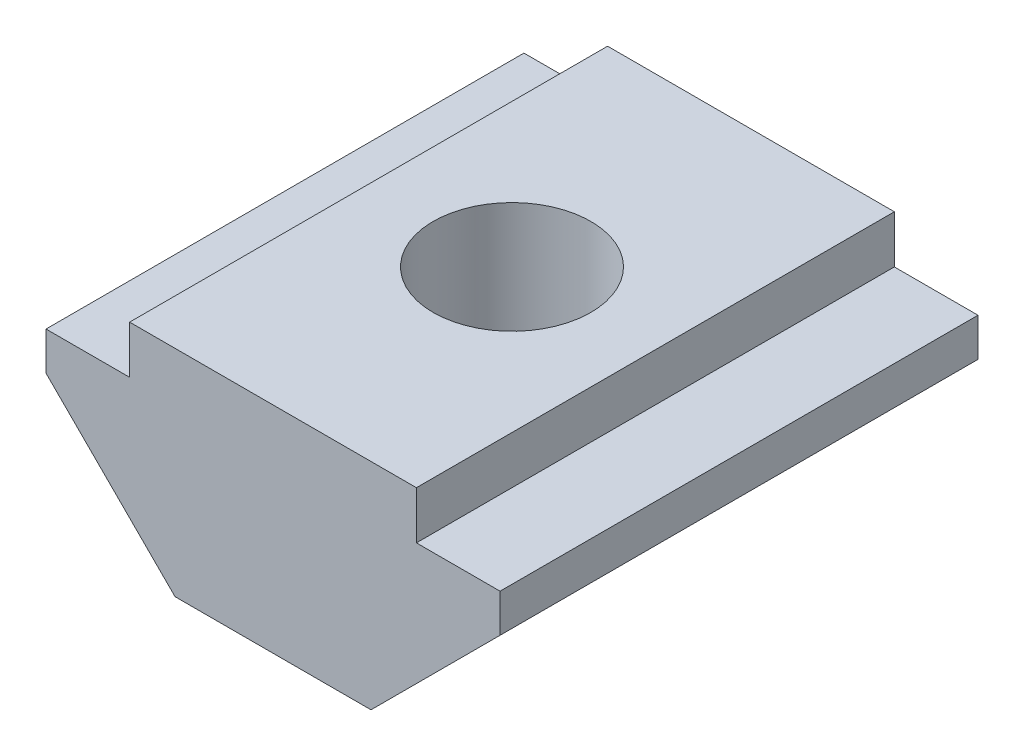
ISO-10303-21;
HEADER;
FILE_DESCRIPTION(('STEP AP214'),'2;1');
FILE_NAME('part.step','',(''),(''),'','','');
FILE_SCHEMA(('AUTOMOTIVE_DESIGN { 1 0 10303 214 1 1 1 1 }'));
ENDSEC;
DATA;
#1=APPLICATION_CONTEXT('core data for automotive mechanical design processes');
#2=APPLICATION_PROTOCOL_DEFINITION('international standard','automotive_design',2000,#1);
#3=PRODUCT_CONTEXT('',#1,'mechanical');
#4=PRODUCT('Part','Part','',(#3));
#5=PRODUCT_RELATED_PRODUCT_CATEGORY('part','',(#4));
#6=PRODUCT_DEFINITION_FORMATION('','',#4);
#7=PRODUCT_DEFINITION_CONTEXT('part definition',#1,'design');
#8=PRODUCT_DEFINITION('design','',#6,#7);
#9=PRODUCT_DEFINITION_SHAPE('','',#8);
#10=(LENGTH_UNIT() NAMED_UNIT(*) SI_UNIT(.MILLI.,.METRE.));
#11=(NAMED_UNIT(*) PLANE_ANGLE_UNIT() SI_UNIT($,.RADIAN.));
#12=(NAMED_UNIT(*) SI_UNIT($,.STERADIAN.) SOLID_ANGLE_UNIT());
#13=UNCERTAINTY_MEASURE_WITH_UNIT(LENGTH_MEASURE(1.E-05),#10,'distance_accuracy_value','');
#14=(GEOMETRIC_REPRESENTATION_CONTEXT(3) GLOBAL_UNCERTAINTY_ASSIGNED_CONTEXT((#13)) GLOBAL_UNIT_ASSIGNED_CONTEXT((#10,
#11,#12)) REPRESENTATION_CONTEXT('',''));
#15=CARTESIAN_POINT('',(0.,0.,0.));
#16=DIRECTION('',(0.,0.,1.));
#17=DIRECTION('',(1.,0.,0.));
#18=AXIS2_PLACEMENT_3D('',#15,#16,#17);
#19=CARTESIAN_POINT('',(-4.75,0.,5.));
#20=DIRECTION('',(-1.,0.,0.));
#21=DIRECTION('',(0.,0.,1.));
#22=AXIS2_PLACEMENT_3D('',#19,#20,#21);
#23=PLANE('',#22);
#24=DIRECTION('',(0.,1.,0.));
#25=VECTOR('',#24,1.);
#26=CARTESIAN_POINT('',(-4.75,0.,-5.));
#27=LINE('',#26,#25);
#28=CARTESIAN_POINT('',(-4.75,1.88602941176471,-5.));
#29=VERTEX_POINT('',#28);
#30=CARTESIAN_POINT('',(-4.75,2.68602941176471,-5.));
#31=VERTEX_POINT('',#30);
#32=EDGE_CURVE('E147',#29,#31,#27,.T.);
#33=ORIENTED_EDGE('',*,*,#32,.F.);
#34=DIRECTION('',(0.,0.,-1.));
#35=VECTOR('',#34,1.);
#36=CARTESIAN_POINT('',(-4.75,1.88602941176471,5.));
#37=LINE('',#36,#35);
#38=CARTESIAN_POINT('',(-4.75,1.88602941176471,5.));
#39=VERTEX_POINT('',#38);
#40=EDGE_CURVE('E11',#39,#29,#37,.T.);
#41=ORIENTED_EDGE('',*,*,#40,.F.);
#42=DIRECTION('',(0.,1.,0.));
#43=VECTOR('',#42,1.);
#44=CARTESIAN_POINT('',(-4.75,0.,5.));
#45=LINE('',#44,#43);
#46=CARTESIAN_POINT('',(-4.75,2.68602941176471,5.));
#47=VERTEX_POINT('',#46);
#48=EDGE_CURVE('E214',#39,#47,#45,.T.);
#49=ORIENTED_EDGE('',*,*,#48,.T.);
#50=DIRECTION('',(0.,0.,-1.));
#51=VECTOR('',#50,1.);
#52=CARTESIAN_POINT('',(-4.75,2.68602941176471,5.));
#53=LINE('',#52,#51);
#54=EDGE_CURVE('E57',#47,#31,#53,.T.);
#55=ORIENTED_EDGE('',*,*,#54,.T.);
#56=EDGE_LOOP('',(#33,#41,#49,#55));
#57=FACE_BOUND('',#56,.T.);
#58=ADVANCED_FACE('F41',(#57),#23,.T.);
#59=CARTESIAN_POINT('',(-1.43198529411764,-1.43198529411764,5.));
#60=DIRECTION('',(-0.707106781186547,-0.707106781186548,0.));
#61=DIRECTION('',(0.707106781186548,-0.707106781186547,0.));
#62=AXIS2_PLACEMENT_3D('',#59,#60,#61);
#63=PLANE('',#62);
#64=DIRECTION('',(-0.707106781186548,0.707106781186547,0.));
#65=VECTOR('',#64,1.);
#66=CARTESIAN_POINT('',(-1.43198529411764,-1.43198529411764,-5.));
#67=LINE('',#66,#65);
#68=CARTESIAN_POINT('',(-2.04999999999999,-0.813970588235293,-5.));
#69=VERTEX_POINT('',#68);
#70=EDGE_CURVE('E149',#69,#29,#67,.T.);
#71=ORIENTED_EDGE('',*,*,#70,.F.);
#72=DIRECTION('',(0.,0.,-1.));
#73=VECTOR('',#72,1.);
#74=CARTESIAN_POINT('',(-2.04999999999999,-0.813970588235293,5.));
#75=LINE('',#74,#73);
#76=CARTESIAN_POINT('',(-2.04999999999999,-0.813970588235293,5.));
#77=VERTEX_POINT('',#76);
#78=EDGE_CURVE('E49',#77,#69,#75,.T.);
#79=ORIENTED_EDGE('',*,*,#78,.F.);
#80=DIRECTION('',(-0.707106781186548,0.707106781186547,0.));
#81=VECTOR('',#80,1.);
#82=CARTESIAN_POINT('',(-1.43198529411764,-1.43198529411764,5.));
#83=LINE('',#82,#81);
#84=EDGE_CURVE('E212',#77,#39,#83,.T.);
#85=ORIENTED_EDGE('',*,*,#84,.T.);
#86=ORIENTED_EDGE('',*,*,#40,.T.);
#87=EDGE_LOOP('',(#71,#79,#85,#86));
#88=FACE_BOUND('',#87,.T.);
#89=ADVANCED_FACE('F192',(#88),#63,.T.);
#90=CARTESIAN_POINT('',(0.,-0.813970588235292,5.));
#91=DIRECTION('',(0.,-1.,0.));
#92=DIRECTION('',(1.,0.,0.));
#93=AXIS2_PLACEMENT_3D('',#90,#91,#92);
#94=PLANE('',#93);
#95=CARTESIAN_POINT('',(0.,-0.813970588235292,0.));
#96=DIRECTION('',(0.,1.,0.));
#97=DIRECTION('',(0.,0.,1.));
#98=AXIS2_PLACEMENT_3D('',#95,#96,#97);
#99=CIRCLE('',#98,1.65);
#100=CARTESIAN_POINT('',(0.,-0.813970588235292,1.65));
#101=VERTEX_POINT('',#100);
#102=EDGE_CURVE('E150',#101,#101,#99,.T.);
#103=ORIENTED_EDGE('',*,*,#102,.T.);
#104=EDGE_LOOP('',(#103));
#105=FACE_BOUND('',#104,.T.);
#106=DIRECTION('',(-1.,0.,0.));
#107=VECTOR('',#106,1.);
#108=CARTESIAN_POINT('',(0.,-0.813970588235292,-5.));
#109=LINE('',#108,#107);
#110=CARTESIAN_POINT('',(2.04999999999999,-0.813970588235292,-5.));
#111=VERTEX_POINT('',#110);
#112=EDGE_CURVE('E153',#111,#69,#109,.T.);
#113=ORIENTED_EDGE('',*,*,#112,.F.);
#114=DIRECTION('',(0.,0.,-1.));
#115=VECTOR('',#114,1.);
#116=CARTESIAN_POINT('',(2.04999999999999,-0.813970588235292,5.));
#117=LINE('',#116,#115);
#118=CARTESIAN_POINT('',(2.04999999999999,-0.813970588235292,5.));
#119=VERTEX_POINT('',#118);
#120=EDGE_CURVE('E181',#119,#111,#117,.T.);
#121=ORIENTED_EDGE('',*,*,#120,.F.);
#122=DIRECTION('',(-1.,0.,0.));
#123=VECTOR('',#122,1.);
#124=CARTESIAN_POINT('',(0.,-0.813970588235292,5.));
#125=LINE('',#124,#123);
#126=EDGE_CURVE('E188',#119,#77,#125,.T.);
#127=ORIENTED_EDGE('',*,*,#126,.T.);
#128=ORIENTED_EDGE('',*,*,#78,.T.);
#129=EDGE_LOOP('',(#113,#121,#127,#128));
#130=FACE_BOUND('',#129,.T.);
#131=ADVANCED_FACE('F186',(#105,#130),#94,.T.);
#132=CARTESIAN_POINT('',(1.43198529411764,-1.43198529411764,5.));
#133=DIRECTION('',(-0.707106781186547,0.707106781186548,0.));
#134=DIRECTION('',(-0.707106781186548,-0.707106781186547,0.));
#135=AXIS2_PLACEMENT_3D('',#132,#133,#134);
#136=PLANE('',#135);
#137=DIRECTION('',(0.707106781186548,0.707106781186547,0.));
#138=VECTOR('',#137,1.);
#139=CARTESIAN_POINT('',(1.43198529411764,-1.43198529411764,-5.));
#140=LINE('',#139,#138);
#141=CARTESIAN_POINT('',(4.75,1.88602941176471,-5.));
#142=VERTEX_POINT('',#141);
#143=EDGE_CURVE('E156',#111,#142,#140,.T.);
#144=ORIENTED_EDGE('',*,*,#143,.T.);
#145=DIRECTION('',(0.,0.,-1.));
#146=VECTOR('',#145,1.);
#147=CARTESIAN_POINT('',(4.75,1.88602941176471,5.));
#148=LINE('',#147,#146);
#149=CARTESIAN_POINT('',(4.75,1.88602941176471,5.));
#150=VERTEX_POINT('',#149);
#151=EDGE_CURVE('E178',#150,#142,#148,.T.);
#152=ORIENTED_EDGE('',*,*,#151,.F.);
#153=DIRECTION('',(0.707106781186548,0.707106781186547,0.));
#154=VECTOR('',#153,1.);
#155=CARTESIAN_POINT('',(1.43198529411764,-1.43198529411764,5.));
#156=LINE('',#155,#154);
#157=EDGE_CURVE('E207',#119,#150,#156,.T.);
#158=ORIENTED_EDGE('',*,*,#157,.F.);
#159=ORIENTED_EDGE('',*,*,#120,.T.);
#160=EDGE_LOOP('',(#144,#152,#158,#159));
#161=FACE_BOUND('',#160,.T.);
#162=ADVANCED_FACE('F199',(#161),#136,.F.);
#163=CARTESIAN_POINT('',(4.75,0.,5.));
#164=DIRECTION('',(-1.,0.,0.));
#165=DIRECTION('',(0.,0.,1.));
#166=AXIS2_PLACEMENT_3D('',#163,#164,#165);
#167=PLANE('',#166);
#168=DIRECTION('',(0.,1.,0.));
#169=VECTOR('',#168,1.);
#170=CARTESIAN_POINT('',(4.75,0.,-5.));
#171=LINE('',#170,#169);
#172=CARTESIAN_POINT('',(4.75,2.68602941176471,-5.));
#173=VERTEX_POINT('',#172);
#174=EDGE_CURVE('E158',#142,#173,#171,.T.);
#175=ORIENTED_EDGE('',*,*,#174,.T.);
#176=DIRECTION('',(0.,0.,-1.));
#177=VECTOR('',#176,1.);
#178=CARTESIAN_POINT('',(4.75,2.68602941176471,5.));
#179=LINE('',#178,#177);
#180=CARTESIAN_POINT('',(4.75,2.68602941176471,5.));
#181=VERTEX_POINT('',#180);
#182=EDGE_CURVE('E176',#181,#173,#179,.T.);
#183=ORIENTED_EDGE('',*,*,#182,.F.);
#184=DIRECTION('',(0.,1.,0.));
#185=VECTOR('',#184,1.);
#186=CARTESIAN_POINT('',(4.75,0.,5.));
#187=LINE('',#186,#185);
#188=EDGE_CURVE('E205',#150,#181,#187,.T.);
#189=ORIENTED_EDGE('',*,*,#188,.F.);
#190=ORIENTED_EDGE('',*,*,#151,.T.);
#191=EDGE_LOOP('',(#175,#183,#189,#190));
#192=FACE_BOUND('',#191,.T.);
#193=ADVANCED_FACE('F203',(#192),#167,.F.);
#194=CARTESIAN_POINT('',(0.,2.68602941176471,5.));
#195=DIRECTION('',(0.,1.,0.));
#196=DIRECTION('',(-1.,0.,0.));
#197=AXIS2_PLACEMENT_3D('',#194,#195,#196);
#198=PLANE('',#197);
#199=DIRECTION('',(1.,0.,0.));
#200=VECTOR('',#199,1.);
#201=CARTESIAN_POINT('',(0.,2.68602941176471,-5.));
#202=LINE('',#201,#200);
#203=CARTESIAN_POINT('',(3.,2.68602941176471,-5.));
#204=VERTEX_POINT('',#203);
#205=EDGE_CURVE('E161',#204,#173,#202,.T.);
#206=ORIENTED_EDGE('',*,*,#205,.F.);
#207=DIRECTION('',(0.,0.,-1.));
#208=VECTOR('',#207,1.);
#209=CARTESIAN_POINT('',(3.,2.68602941176471,5.));
#210=LINE('',#209,#208);
#211=CARTESIAN_POINT('',(3.,2.68602941176471,5.));
#212=VERTEX_POINT('',#211);
#213=EDGE_CURVE('E174',#212,#204,#210,.T.);
#214=ORIENTED_EDGE('',*,*,#213,.F.);
#215=DIRECTION('',(1.,0.,0.));
#216=VECTOR('',#215,1.);
#217=CARTESIAN_POINT('',(0.,2.68602941176471,5.));
#218=LINE('',#217,#216);
#219=EDGE_CURVE('E143',#212,#181,#218,.T.);
#220=ORIENTED_EDGE('',*,*,#219,.T.);
#221=ORIENTED_EDGE('',*,*,#182,.T.);
#222=EDGE_LOOP('',(#206,#214,#220,#221));
#223=FACE_BOUND('',#222,.T.);
#224=ADVANCED_FACE('F233',(#223),#198,.T.);
#225=CARTESIAN_POINT('',(3.,0.,5.));
#226=DIRECTION('',(1.,0.,0.));
#227=DIRECTION('',(0.,1.,0.));
#228=AXIS2_PLACEMENT_3D('',#225,#226,#227);
#229=PLANE('',#228);
#230=DIRECTION('',(0.,-1.,0.));
#231=VECTOR('',#230,1.);
#232=CARTESIAN_POINT('',(3.,0.,-5.));
#233=LINE('',#232,#231);
#234=CARTESIAN_POINT('',(3.,3.68602941176471,-5.));
#235=VERTEX_POINT('',#234);
#236=EDGE_CURVE('E164',#235,#204,#233,.T.);
#237=ORIENTED_EDGE('',*,*,#236,.F.);
#238=DIRECTION('',(0.,0.,-1.));
#239=VECTOR('',#238,1.);
#240=CARTESIAN_POINT('',(3.,3.68602941176471,5.));
#241=LINE('',#240,#239);
#242=CARTESIAN_POINT('',(3.,3.68602941176471,5.));
#243=VERTEX_POINT('',#242);
#244=EDGE_CURVE('E129',#243,#235,#241,.T.);
#245=ORIENTED_EDGE('',*,*,#244,.F.);
#246=DIRECTION('',(0.,-1.,0.));
#247=VECTOR('',#246,1.);
#248=CARTESIAN_POINT('',(3.,0.,5.));
#249=LINE('',#248,#247);
#250=EDGE_CURVE('E141',#243,#212,#249,.T.);
#251=ORIENTED_EDGE('',*,*,#250,.T.);
#252=ORIENTED_EDGE('',*,*,#213,.T.);
#253=EDGE_LOOP('',(#237,#245,#251,#252));
#254=FACE_BOUND('',#253,.T.);
#255=ADVANCED_FACE('F225',(#254),#229,.T.);
#256=CARTESIAN_POINT('',(0.,3.68602941176471,5.));
#257=DIRECTION('',(0.,1.,0.));
#258=DIRECTION('',(-1.,0.,0.));
#259=AXIS2_PLACEMENT_3D('',#256,#257,#258);
#260=PLANE('',#259);
#261=CARTESIAN_POINT('',(0.,3.68602941176471,0.));
#262=DIRECTION('',(0.,1.,0.));
#263=DIRECTION('',(0.,0.,1.));
#264=AXIS2_PLACEMENT_3D('',#261,#262,#263);
#265=CIRCLE('',#264,1.65);
#266=CARTESIAN_POINT('',(0.,3.68602941176471,1.65));
#267=VERTEX_POINT('',#266);
#268=EDGE_CURVE('E218',#267,#267,#265,.T.);
#269=ORIENTED_EDGE('',*,*,#268,.F.);
#270=EDGE_LOOP('',(#269));
#271=FACE_BOUND('',#270,.T.);
#272=DIRECTION('',(1.,0.,0.));
#273=VECTOR('',#272,1.);
#274=CARTESIAN_POINT('',(0.,3.68602941176471,-5.));
#275=LINE('',#274,#273);
#276=CARTESIAN_POINT('',(-3.,3.68602941176471,-5.));
#277=VERTEX_POINT('',#276);
#278=EDGE_CURVE('E126',#277,#235,#275,.T.);
#279=ORIENTED_EDGE('',*,*,#278,.F.);
#280=DIRECTION('',(0.,0.,-1.));
#281=VECTOR('',#280,1.);
#282=CARTESIAN_POINT('',(-3.,3.68602941176471,5.));
#283=LINE('',#282,#281);
#284=CARTESIAN_POINT('',(-3.,3.68602941176471,5.));
#285=VERTEX_POINT('',#284);
#286=EDGE_CURVE('E120',#285,#277,#283,.T.);
#287=ORIENTED_EDGE('',*,*,#286,.F.);
#288=DIRECTION('',(1.,0.,0.));
#289=VECTOR('',#288,1.);
#290=CARTESIAN_POINT('',(0.,3.68602941176471,5.));
#291=LINE('',#290,#289);
#292=EDGE_CURVE('E124',#285,#243,#291,.T.);
#293=ORIENTED_EDGE('',*,*,#292,.T.);
#294=ORIENTED_EDGE('',*,*,#244,.T.);
#295=EDGE_LOOP('',(#279,#287,#293,#294));
#296=FACE_BOUND('',#295,.T.);
#297=ADVANCED_FACE('F122',(#271,#296),#260,.T.);
#298=CARTESIAN_POINT('',(-3.,0.,5.));
#299=DIRECTION('',(1.,0.,0.));
#300=DIRECTION('',(0.,1.,0.));
#301=AXIS2_PLACEMENT_3D('',#298,#299,#300);
#302=PLANE('',#301);
#303=DIRECTION('',(0.,-1.,0.));
#304=VECTOR('',#303,1.);
#305=CARTESIAN_POINT('',(-3.,0.,-5.));
#306=LINE('',#305,#304);
#307=CARTESIAN_POINT('',(-3.,2.68602941176471,-5.));
#308=VERTEX_POINT('',#307);
#309=EDGE_CURVE('E169',#277,#308,#306,.T.);
#310=ORIENTED_EDGE('',*,*,#309,.T.);
#311=DIRECTION('',(0.,0.,-1.));
#312=VECTOR('',#311,1.);
#313=CARTESIAN_POINT('',(-3.,2.68602941176471,5.));
#314=LINE('',#313,#312);
#315=CARTESIAN_POINT('',(-3.,2.68602941176471,5.));
#316=VERTEX_POINT('',#315);
#317=EDGE_CURVE('E89',#316,#308,#314,.T.);
#318=ORIENTED_EDGE('',*,*,#317,.F.);
#319=DIRECTION('',(0.,-1.,0.));
#320=VECTOR('',#319,1.);
#321=CARTESIAN_POINT('',(-3.,0.,5.));
#322=LINE('',#321,#320);
#323=EDGE_CURVE('E131',#285,#316,#322,.T.);
#324=ORIENTED_EDGE('',*,*,#323,.F.);
#325=ORIENTED_EDGE('',*,*,#286,.T.);
#326=EDGE_LOOP('',(#310,#318,#324,#325));
#327=FACE_BOUND('',#326,.T.);
#328=ADVANCED_FACE('F132',(#327),#302,.F.);
#329=EDGE_CURVE('E165',#31,#308,#202,.T.);
#330=ORIENTED_EDGE('',*,*,#329,.F.);
#331=ORIENTED_EDGE('',*,*,#54,.F.);
#332=EDGE_CURVE('E135',#47,#316,#218,.T.);
#333=ORIENTED_EDGE('',*,*,#332,.T.);
#334=ORIENTED_EDGE('',*,*,#317,.T.);
#335=EDGE_LOOP('',(#330,#331,#333,#334));
#336=FACE_BOUND('',#335,.T.);
#337=ADVANCED_FACE('F231',(#336),#198,.T.);
#338=CARTESIAN_POINT('',(0.,0.,5.));
#339=DIRECTION('',(0.,0.,1.));
#340=DIRECTION('',(1.,0.,0.));
#341=AXIS2_PLACEMENT_3D('',#338,#339,#340);
#342=PLANE('',#341);
#343=ORIENTED_EDGE('',*,*,#48,.F.);
#344=ORIENTED_EDGE('',*,*,#84,.F.);
#345=ORIENTED_EDGE('',*,*,#126,.F.);
#346=ORIENTED_EDGE('',*,*,#157,.T.);
#347=ORIENTED_EDGE('',*,*,#188,.T.);
#348=ORIENTED_EDGE('',*,*,#219,.F.);
#349=ORIENTED_EDGE('',*,*,#250,.F.);
#350=ORIENTED_EDGE('',*,*,#292,.F.);
#351=ORIENTED_EDGE('',*,*,#323,.T.);
#352=ORIENTED_EDGE('',*,*,#332,.F.);
#353=EDGE_LOOP('',(#343,#344,#345,#346,#347,#348,#349,#350,#351,#352));
#354=FACE_BOUND('',#353,.T.);
#355=ADVANCED_FACE('F138',(#354),#342,.T.);
#356=CARTESIAN_POINT('',(0.,0.,-5.));
#357=DIRECTION('',(0.,0.,1.));
#358=DIRECTION('',(1.,0.,0.));
#359=AXIS2_PLACEMENT_3D('',#356,#357,#358);
#360=PLANE('',#359);
#361=ORIENTED_EDGE('',*,*,#32,.T.);
#362=ORIENTED_EDGE('',*,*,#329,.T.);
#363=ORIENTED_EDGE('',*,*,#309,.F.);
#364=ORIENTED_EDGE('',*,*,#278,.T.);
#365=ORIENTED_EDGE('',*,*,#236,.T.);
#366=ORIENTED_EDGE('',*,*,#205,.T.);
#367=ORIENTED_EDGE('',*,*,#174,.F.);
#368=ORIENTED_EDGE('',*,*,#143,.F.);
#369=ORIENTED_EDGE('',*,*,#112,.T.);
#370=ORIENTED_EDGE('',*,*,#70,.T.);
#371=EDGE_LOOP('',(#361,#362,#363,#364,#365,#366,#367,#368,#369,#370));
#372=FACE_BOUND('',#371,.T.);
#373=ADVANCED_FACE('F195',(#372),#360,.F.);
#374=CARTESIAN_POINT('',(0.,3.68602941176471,0.));
#375=DIRECTION('',(0.,1.,0.));
#376=DIRECTION('',(0.,0.,1.));
#377=AXIS2_PLACEMENT_3D('',#374,#375,#376);
#378=CYLINDRICAL_SURFACE('',#377,1.65);
#379=ORIENTED_EDGE('',*,*,#102,.F.);
#380=EDGE_LOOP('',(#379));
#381=FACE_BOUND('',#380,.T.);
#382=ORIENTED_EDGE('',*,*,#268,.T.);
#383=EDGE_LOOP('',(#382));
#384=FACE_BOUND('',#383,.T.);
#385=ADVANCED_FACE('F222',(#381,#384),#378,.F.);
#386=CLOSED_SHELL('',(#58,#89,#131,#162,#193,#224,#255,#297,#328,#337,#355,#373,#385));
#387=MANIFOLD_SOLID_BREP('B2',#386);
#388=ADVANCED_BREP_SHAPE_REPRESENTATION('',(#18,#387),#14);
#389=SHAPE_DEFINITION_REPRESENTATION(#9,#388);
ENDSEC;
END-ISO-10303-21;
